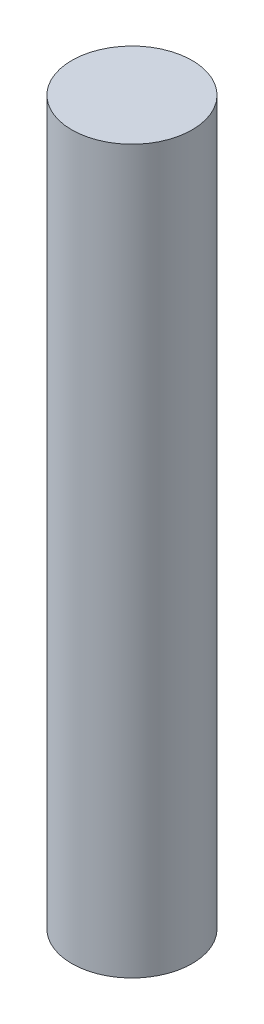
ISO-10303-21;
HEADER;
FILE_DESCRIPTION(('STEP AP214'),'2;1');
FILE_NAME('part.step','',(''),(''),'','','');
FILE_SCHEMA(('AUTOMOTIVE_DESIGN { 1 0 10303 214 1 1 1 1 }'));
ENDSEC;
DATA;
#1=APPLICATION_CONTEXT('core data for automotive mechanical design processes');
#2=APPLICATION_PROTOCOL_DEFINITION('international standard','automotive_design',2000,#1);
#3=PRODUCT_CONTEXT('',#1,'mechanical');
#4=PRODUCT('Part','Part','',(#3));
#5=PRODUCT_RELATED_PRODUCT_CATEGORY('part','',(#4));
#6=PRODUCT_DEFINITION_FORMATION('','',#4);
#7=PRODUCT_DEFINITION_CONTEXT('part definition',#1,'design');
#8=PRODUCT_DEFINITION('design','',#6,#7);
#9=PRODUCT_DEFINITION_SHAPE('','',#8);
#10=(LENGTH_UNIT() NAMED_UNIT(*) SI_UNIT(.MILLI.,.METRE.));
#11=(NAMED_UNIT(*) PLANE_ANGLE_UNIT() SI_UNIT($,.RADIAN.));
#12=(NAMED_UNIT(*) SI_UNIT($,.STERADIAN.) SOLID_ANGLE_UNIT());
#13=UNCERTAINTY_MEASURE_WITH_UNIT(LENGTH_MEASURE(1.E-05),#10,'distance_accuracy_value','');
#14=(GEOMETRIC_REPRESENTATION_CONTEXT(3) GLOBAL_UNCERTAINTY_ASSIGNED_CONTEXT((#13)) GLOBAL_UNIT_ASSIGNED_CONTEXT((#10,
#11,#12)) REPRESENTATION_CONTEXT('',''));
#15=CARTESIAN_POINT('',(0.,0.,0.));
#16=DIRECTION('',(0.,0.,1.));
#17=DIRECTION('',(1.,0.,0.));
#18=AXIS2_PLACEMENT_3D('',#15,#16,#17);
#19=CARTESIAN_POINT('',(0.,2.25,0.));
#20=DIRECTION('',(0.,-1.,0.));
#21=DIRECTION('',(0.,0.,-1.));
#22=AXIS2_PLACEMENT_3D('',#19,#20,#21);
#23=CYLINDRICAL_SURFACE('',#22,0.1875);
#24=CARTESIAN_POINT('',(0.,2.25,0.));
#25=DIRECTION('',(0.,1.,0.));
#26=DIRECTION('',(0.,0.,1.));
#27=AXIS2_PLACEMENT_3D('',#24,#25,#26);
#28=CIRCLE('',#27,0.1875);
#29=CARTESIAN_POINT('',(0.,2.25,0.1875));
#30=VERTEX_POINT('',#29);
#31=EDGE_CURVE('E10',#30,#30,#28,.T.);
#32=ORIENTED_EDGE('',*,*,#31,.F.);
#33=EDGE_LOOP('',(#32));
#34=FACE_BOUND('',#33,.T.);
#35=CARTESIAN_POINT('',(0.,0.,0.));
#36=DIRECTION('',(0.,1.,0.));
#37=DIRECTION('',(0.,0.,1.));
#38=AXIS2_PLACEMENT_3D('',#35,#36,#37);
#39=CIRCLE('',#38,0.1875);
#40=CARTESIAN_POINT('',(0.,0.,0.1875));
#41=VERTEX_POINT('',#40);
#42=EDGE_CURVE('E40',#41,#41,#39,.T.);
#43=ORIENTED_EDGE('',*,*,#42,.T.);
#44=EDGE_LOOP('',(#43));
#45=FACE_BOUND('',#44,.T.);
#46=ADVANCED_FACE('F37',(#34,#45),#23,.T.);
#47=CARTESIAN_POINT('',(0.,2.25,0.));
#48=DIRECTION('',(0.,1.,0.));
#49=DIRECTION('',(0.,0.,1.));
#50=AXIS2_PLACEMENT_3D('',#47,#48,#49);
#51=PLANE('',#50);
#52=ORIENTED_EDGE('',*,*,#31,.T.);
#53=EDGE_LOOP('',(#52));
#54=FACE_BOUND('',#53,.T.);
#55=ADVANCED_FACE('F54',(#54),#51,.T.);
#56=CARTESIAN_POINT('',(0.,0.,0.));
#57=DIRECTION('',(0.,1.,0.));
#58=DIRECTION('',(0.,0.,1.));
#59=AXIS2_PLACEMENT_3D('',#56,#57,#58);
#60=PLANE('',#59);
#61=ORIENTED_EDGE('',*,*,#42,.F.);
#62=EDGE_LOOP('',(#61));
#63=FACE_BOUND('',#62,.T.);
#64=ADVANCED_FACE('F52',(#63),#60,.F.);
#65=CLOSED_SHELL('',(#46,#55,#64));
#66=MANIFOLD_SOLID_BREP('B2',#65);
#67=ADVANCED_BREP_SHAPE_REPRESENTATION('',(#18,#66),#14);
#68=SHAPE_DEFINITION_REPRESENTATION(#9,#67);
ENDSEC;
END-ISO-10303-21;
